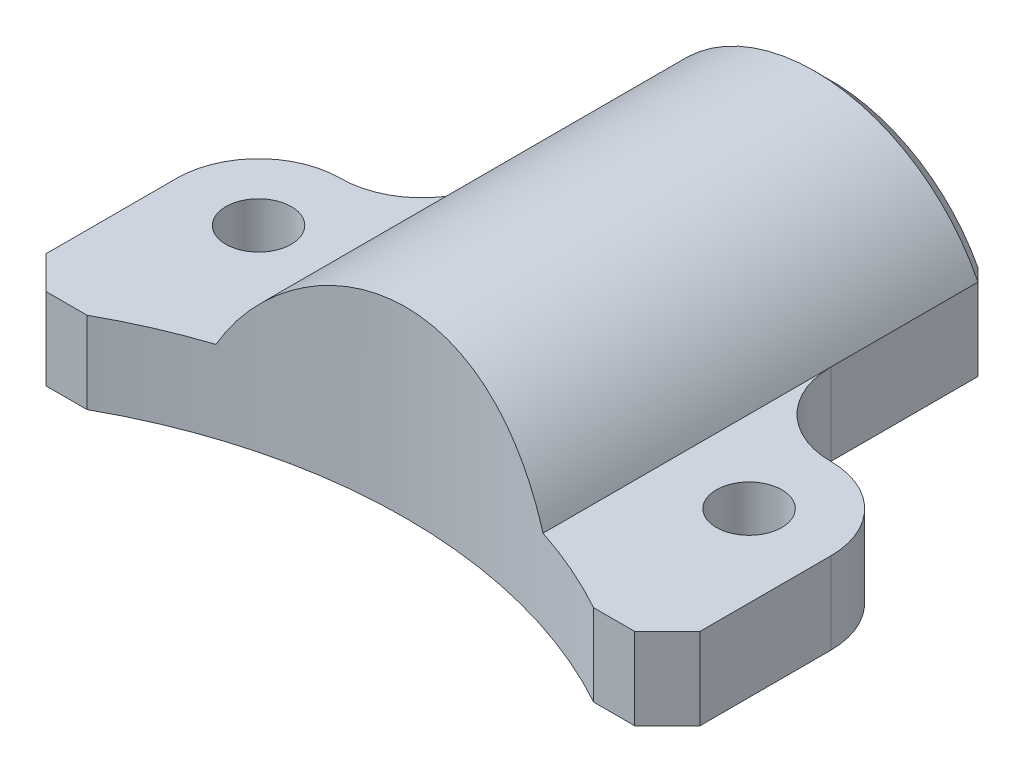
ISO-10303-21;
HEADER;
FILE_DESCRIPTION(('STEP AP214'),'2;1');
FILE_NAME('part.step','',(''),(''),'','','');
FILE_SCHEMA(('AUTOMOTIVE_DESIGN { 1 0 10303 214 1 1 1 1 }'));
ENDSEC;
DATA;
#1=APPLICATION_CONTEXT('core data for automotive mechanical design processes');
#2=APPLICATION_PROTOCOL_DEFINITION('international standard','automotive_design',2000,#1);
#3=PRODUCT_CONTEXT('',#1,'mechanical');
#4=PRODUCT('Part','Part','',(#3));
#5=PRODUCT_RELATED_PRODUCT_CATEGORY('part','',(#4));
#6=PRODUCT_DEFINITION_FORMATION('','',#4);
#7=PRODUCT_DEFINITION_CONTEXT('part definition',#1,'design');
#8=PRODUCT_DEFINITION('design','',#6,#7);
#9=PRODUCT_DEFINITION_SHAPE('','',#8);
#10=(LENGTH_UNIT() NAMED_UNIT(*) SI_UNIT(.MILLI.,.METRE.));
#11=(NAMED_UNIT(*) PLANE_ANGLE_UNIT() SI_UNIT($,.RADIAN.));
#12=(NAMED_UNIT(*) SI_UNIT($,.STERADIAN.) SOLID_ANGLE_UNIT());
#13=UNCERTAINTY_MEASURE_WITH_UNIT(LENGTH_MEASURE(1.E-05),#10,'distance_accuracy_value','');
#14=(GEOMETRIC_REPRESENTATION_CONTEXT(3) GLOBAL_UNCERTAINTY_ASSIGNED_CONTEXT((#13)) GLOBAL_UNIT_ASSIGNED_CONTEXT((#10,
#11,#12)) REPRESENTATION_CONTEXT('',''));
#15=CARTESIAN_POINT('',(0.,0.,0.));
#16=DIRECTION('',(0.,0.,1.));
#17=DIRECTION('',(1.,0.,0.));
#18=AXIS2_PLACEMENT_3D('',#15,#16,#17);
#19=CARTESIAN_POINT('',(-20.,5.,15.));
#20=DIRECTION('',(0.,0.,-1.));
#21=DIRECTION('',(-1.,0.,0.));
#22=AXIS2_PLACEMENT_3D('',#19,#20,#21);
#23=PLANE('',#22);
#24=DIRECTION('',(1.,0.,0.));
#25=VECTOR('',#24,1.);
#26=CARTESIAN_POINT('',(-20.,5.,15.));
#27=LINE('',#26,#25);
#28=CARTESIAN_POINT('',(15.4919333848297,5.,15.));
#29=VERTEX_POINT('',#28);
#30=CARTESIAN_POINT('',(18.,5.,15.));
#31=VERTEX_POINT('',#30);
#32=EDGE_CURVE('E186',#29,#31,#27,.T.);
#33=ORIENTED_EDGE('',*,*,#32,.F.);
#34=DIRECTION('',(0.,-1.,0.));
#35=VECTOR('',#34,1.);
#36=CARTESIAN_POINT('',(15.4919333848297,11.1803398874989,15.));
#37=LINE('',#36,#35);
#38=CARTESIAN_POINT('',(15.4919333848297,0.,15.));
#39=VERTEX_POINT('',#38);
#40=EDGE_CURVE('E173',#29,#39,#37,.T.);
#41=ORIENTED_EDGE('',*,*,#40,.T.);
#42=DIRECTION('',(1.,0.,0.));
#43=VECTOR('',#42,1.);
#44=CARTESIAN_POINT('',(-20.,0.,15.));
#45=LINE('',#44,#43);
#46=CARTESIAN_POINT('',(18.,0.,15.));
#47=VERTEX_POINT('',#46);
#48=EDGE_CURVE('E184',#39,#47,#45,.T.);
#49=ORIENTED_EDGE('',*,*,#48,.T.);
#50=DIRECTION('',(0.,1.,0.));
#51=VECTOR('',#50,1.);
#52=CARTESIAN_POINT('',(18.,5.,15.));
#53=LINE('',#52,#51);
#54=EDGE_CURVE('E450',#47,#31,#53,.T.);
#55=ORIENTED_EDGE('',*,*,#54,.T.);
#56=EDGE_LOOP('',(#33,#41,#49,#55));
#57=FACE_BOUND('',#56,.T.);
#58=ADVANCED_FACE('F32',(#57),#23,.F.);
#59=CARTESIAN_POINT('',(0.,5.,0.));
#60=DIRECTION('',(0.,-1.,0.));
#61=DIRECTION('',(0.,0.,-1.));
#62=AXIS2_PLACEMENT_3D('',#59,#60,#61);
#63=PLANE('',#62);
#64=CARTESIAN_POINT('',(-15.,5.,5.));
#65=DIRECTION('',(0.,-1.,0.));
#66=DIRECTION('',(0.,0.,-1.));
#67=AXIS2_PLACEMENT_3D('',#64,#65,#66);
#68=CIRCLE('',#67,2.);
#69=CARTESIAN_POINT('',(-15.,5.,3.));
#70=VERTEX_POINT('',#69);
#71=EDGE_CURVE('E377',#70,#70,#68,.T.);
#72=ORIENTED_EDGE('',*,*,#71,.T.);
#73=EDGE_LOOP('',(#72));
#74=FACE_BOUND('',#73,.T.);
#75=CARTESIAN_POINT('',(-18.,5.,15.));
#76=VERTEX_POINT('',#75);
#77=CARTESIAN_POINT('',(-15.4919333848297,5.,15.));
#78=VERTEX_POINT('',#77);
#79=EDGE_CURVE('E207',#76,#78,#27,.T.);
#80=ORIENTED_EDGE('',*,*,#79,.T.);
#81=CARTESIAN_POINT('',(0.,5.,43.));
#82=DIRECTION('',(0.,-1.,0.));
#83=DIRECTION('',(0.,0.,-1.));
#84=AXIS2_PLACEMENT_3D('',#81,#82,#83);
#85=CIRCLE('',#84,32.);
#86=CARTESIAN_POINT('',(-10.,5.,12.6026316928587));
#87=VERTEX_POINT('',#86);
#88=EDGE_CURVE('E390',#78,#87,#85,.T.);
#89=ORIENTED_EDGE('',*,*,#88,.T.);
#90=DIRECTION('',(0.,0.,1.));
#91=VECTOR('',#90,1.);
#92=CARTESIAN_POINT('',(-10.,5.,-15.));
#93=LINE('',#92,#91);
#94=CARTESIAN_POINT('',(-10.,5.,-5.));
#95=VERTEX_POINT('',#94);
#96=EDGE_CURVE('E365',#95,#87,#93,.T.);
#97=ORIENTED_EDGE('',*,*,#96,.F.);
#98=CARTESIAN_POINT('',(-15.,5.,-5.));
#99=DIRECTION('',(0.,-1.,0.));
#100=DIRECTION('',(0.,0.,-1.));
#101=AXIS2_PLACEMENT_3D('',#98,#99,#100);
#102=CIRCLE('',#101,5.);
#103=CARTESIAN_POINT('',(-15.,5.,0.));
#104=VERTEX_POINT('',#103);
#105=EDGE_CURVE('E442',#95,#104,#102,.T.);
#106=ORIENTED_EDGE('',*,*,#105,.T.);
#107=CARTESIAN_POINT('',(-15.,5.,5.));
#108=DIRECTION('',(0.,-1.,0.));
#109=DIRECTION('',(0.,0.,-1.));
#110=AXIS2_PLACEMENT_3D('',#107,#108,#109);
#111=CIRCLE('',#110,5.);
#112=CARTESIAN_POINT('',(-20.,5.,5.));
#113=VERTEX_POINT('',#112);
#114=EDGE_CURVE('E458',#104,#113,#111,.F.);
#115=ORIENTED_EDGE('',*,*,#114,.T.);
#116=DIRECTION('',(0.,0.,1.));
#117=VECTOR('',#116,1.);
#118=CARTESIAN_POINT('',(-20.,5.,15.));
#119=LINE('',#118,#117);
#120=CARTESIAN_POINT('',(-20.,5.,13.));
#121=VERTEX_POINT('',#120);
#122=EDGE_CURVE('E360',#113,#121,#119,.T.);
#123=ORIENTED_EDGE('',*,*,#122,.T.);
#124=DIRECTION('',(-0.707106781186546,0.,-0.707106781186549));
#125=VECTOR('',#124,1.);
#126=CARTESIAN_POINT('',(-18.,5.,15.));
#127=LINE('',#126,#125);
#128=EDGE_CURVE('E336',#121,#76,#127,.F.);
#129=ORIENTED_EDGE('',*,*,#128,.T.);
#130=EDGE_LOOP('',(#80,#89,#97,#106,#115,#123,#129));
#131=FACE_BOUND('',#130,.T.);
#132=ADVANCED_FACE('F300',(#74,#131),#63,.F.);
#133=CARTESIAN_POINT('',(15.,5.,5.));
#134=DIRECTION('',(0.,-1.,0.));
#135=DIRECTION('',(0.,0.,-1.));
#136=AXIS2_PLACEMENT_3D('',#133,#134,#135);
#137=CIRCLE('',#136,2.);
#138=CARTESIAN_POINT('',(15.,5.,3.));
#139=VERTEX_POINT('',#138);
#140=EDGE_CURVE('E381',#139,#139,#137,.T.);
#141=ORIENTED_EDGE('',*,*,#140,.T.);
#142=EDGE_LOOP('',(#141));
#143=FACE_BOUND('',#142,.T.);
#144=DIRECTION('',(0.,0.,-1.));
#145=VECTOR('',#144,1.);
#146=CARTESIAN_POINT('',(10.,5.,-15.));
#147=LINE('',#146,#145);
#148=CARTESIAN_POINT('',(10.,5.,12.6026316928587));
#149=VERTEX_POINT('',#148);
#150=CARTESIAN_POINT('',(10.,5.,-5.));
#151=VERTEX_POINT('',#150);
#152=EDGE_CURVE('E353',#149,#151,#147,.T.);
#153=ORIENTED_EDGE('',*,*,#152,.F.);
#154=CARTESIAN_POINT('',(0.,5.,43.));
#155=DIRECTION('',(0.,-1.,0.));
#156=DIRECTION('',(0.,0.,-1.));
#157=AXIS2_PLACEMENT_3D('',#154,#155,#156);
#158=CIRCLE('',#157,32.);
#159=EDGE_CURVE('E52',#149,#29,#158,.T.);
#160=ORIENTED_EDGE('',*,*,#159,.T.);
#161=ORIENTED_EDGE('',*,*,#32,.T.);
#162=DIRECTION('',(-0.707106781186549,0.,0.707106781186546));
#163=VECTOR('',#162,1.);
#164=CARTESIAN_POINT('',(20.,5.,13.));
#165=LINE('',#164,#163);
#166=CARTESIAN_POINT('',(20.,5.,13.));
#167=VERTEX_POINT('',#166);
#168=EDGE_CURVE('E45',#31,#167,#165,.F.);
#169=ORIENTED_EDGE('',*,*,#168,.T.);
#170=DIRECTION('',(0.,0.,-1.));
#171=VECTOR('',#170,1.);
#172=CARTESIAN_POINT('',(20.,5.,15.));
#173=LINE('',#172,#171);
#174=CARTESIAN_POINT('',(20.,5.,5.));
#175=VERTEX_POINT('',#174);
#176=EDGE_CURVE('E197',#167,#175,#173,.T.);
#177=ORIENTED_EDGE('',*,*,#176,.T.);
#178=CARTESIAN_POINT('',(15.,5.,5.));
#179=DIRECTION('',(0.,-1.,0.));
#180=DIRECTION('',(0.,0.,-1.));
#181=AXIS2_PLACEMENT_3D('',#178,#179,#180);
#182=CIRCLE('',#181,5.);
#183=CARTESIAN_POINT('',(15.,5.,0.));
#184=VERTEX_POINT('',#183);
#185=EDGE_CURVE('E460',#175,#184,#182,.F.);
#186=ORIENTED_EDGE('',*,*,#185,.T.);
#187=CARTESIAN_POINT('',(15.,5.,-5.));
#188=DIRECTION('',(0.,-1.,0.));
#189=DIRECTION('',(0.,0.,-1.));
#190=AXIS2_PLACEMENT_3D('',#187,#188,#189);
#191=CIRCLE('',#190,5.);
#192=EDGE_CURVE('E396',#184,#151,#191,.T.);
#193=ORIENTED_EDGE('',*,*,#192,.T.);
#194=EDGE_LOOP('',(#153,#160,#161,#169,#177,#186,#193));
#195=FACE_BOUND('',#194,.T.);
#196=ADVANCED_FACE('F306',(#143,#195),#63,.F.);
#197=CARTESIAN_POINT('',(20.,5.,15.));
#198=DIRECTION('',(-1.,0.,0.));
#199=DIRECTION('',(0.,0.,1.));
#200=AXIS2_PLACEMENT_3D('',#197,#198,#199);
#201=PLANE('',#200);
#202=ORIENTED_EDGE('',*,*,#176,.F.);
#203=DIRECTION('',(0.,-1.,0.));
#204=VECTOR('',#203,1.);
#205=CARTESIAN_POINT('',(20.,5.,13.));
#206=LINE('',#205,#204);
#207=CARTESIAN_POINT('',(20.,0.,13.));
#208=VERTEX_POINT('',#207);
#209=EDGE_CURVE('E338',#167,#208,#206,.T.);
#210=ORIENTED_EDGE('',*,*,#209,.T.);
#211=DIRECTION('',(0.,0.,-1.));
#212=VECTOR('',#211,1.);
#213=CARTESIAN_POINT('',(20.,0.,15.));
#214=LINE('',#213,#212);
#215=CARTESIAN_POINT('',(20.,0.,5.));
#216=VERTEX_POINT('',#215);
#217=EDGE_CURVE('E347',#208,#216,#214,.T.);
#218=ORIENTED_EDGE('',*,*,#217,.T.);
#219=DIRECTION('',(0.,1.,0.));
#220=VECTOR('',#219,1.);
#221=CARTESIAN_POINT('',(20.,5.,5.));
#222=LINE('',#221,#220);
#223=EDGE_CURVE('E239',#216,#175,#222,.T.);
#224=ORIENTED_EDGE('',*,*,#223,.T.);
#225=EDGE_LOOP('',(#202,#210,#218,#224));
#226=FACE_BOUND('',#225,.T.);
#227=ADVANCED_FACE('F345',(#226),#201,.F.);
#228=CARTESIAN_POINT('',(-20.,5.,-15.));
#229=DIRECTION('',(0.,0.,1.));
#230=DIRECTION('',(1.,0.,0.));
#231=AXIS2_PLACEMENT_3D('',#228,#229,#230);
#232=PLANE('',#231);
#233=CARTESIAN_POINT('',(0.,0.,-15.));
#234=DIRECTION('',(0.,0.,1.));
#235=DIRECTION('',(1.,0.,0.));
#236=AXIS2_PLACEMENT_3D('',#233,#234,#235);
#237=CIRCLE('',#236,10.1803398874989);
#238=CARTESIAN_POINT('',(-8.99999999999972,4.7580794681265,-15.));
#239=VERTEX_POINT('',#238);
#240=CARTESIAN_POINT('',(8.99999999999972,4.7580794681265,-15.));
#241=VERTEX_POINT('',#240);
#242=EDGE_CURVE('E217',#239,#241,#237,.F.);
#243=ORIENTED_EDGE('',*,*,#242,.T.);
#244=DIRECTION('',(0.,-1.,0.));
#245=VECTOR('',#244,1.);
#246=CARTESIAN_POINT('',(8.99999999999999,5.,-15.));
#247=LINE('',#246,#245);
#248=CARTESIAN_POINT('',(8.99999999999999,0.,-15.));
#249=VERTEX_POINT('',#248);
#250=EDGE_CURVE('E221',#241,#249,#247,.T.);
#251=ORIENTED_EDGE('',*,*,#250,.T.);
#252=DIRECTION('',(-1.,0.,0.));
#253=VECTOR('',#252,1.);
#254=CARTESIAN_POINT('',(-20.,0.,-15.));
#255=LINE('',#254,#253);
#256=CARTESIAN_POINT('',(5.,0.,-15.));
#257=VERTEX_POINT('',#256);
#258=EDGE_CURVE('E199',#249,#257,#255,.T.);
#259=ORIENTED_EDGE('',*,*,#258,.T.);
#260=CARTESIAN_POINT('',(0.,0.,-15.));
#261=DIRECTION('',(0.,0.,1.));
#262=DIRECTION('',(1.,0.,0.));
#263=AXIS2_PLACEMENT_3D('',#260,#261,#262);
#264=CIRCLE('',#263,5.);
#265=CARTESIAN_POINT('',(-5.,0.,-15.));
#266=VERTEX_POINT('',#265);
#267=EDGE_CURVE('E215',#257,#266,#264,.T.);
#268=ORIENTED_EDGE('',*,*,#267,.T.);
#269=CARTESIAN_POINT('',(-8.99999999999999,0.,-15.));
#270=VERTEX_POINT('',#269);
#271=EDGE_CURVE('E352',#266,#270,#255,.T.);
#272=ORIENTED_EDGE('',*,*,#271,.T.);
#273=DIRECTION('',(0.,1.,0.));
#274=VECTOR('',#273,1.);
#275=CARTESIAN_POINT('',(-8.99999999999999,5.,-15.));
#276=LINE('',#275,#274);
#277=EDGE_CURVE('E219',#270,#239,#276,.T.);
#278=ORIENTED_EDGE('',*,*,#277,.T.);
#279=EDGE_LOOP('',(#243,#251,#259,#268,#272,#278));
#280=FACE_BOUND('',#279,.T.);
#281=ADVANCED_FACE('F319',(#280),#232,.F.);
#282=CARTESIAN_POINT('',(-20.,5.,15.));
#283=DIRECTION('',(1.,0.,0.));
#284=DIRECTION('',(0.,0.,-1.));
#285=AXIS2_PLACEMENT_3D('',#282,#283,#284);
#286=PLANE('',#285);
#287=DIRECTION('',(0.,0.,1.));
#288=VECTOR('',#287,1.);
#289=CARTESIAN_POINT('',(-20.,0.,15.));
#290=LINE('',#289,#288);
#291=CARTESIAN_POINT('',(-20.,0.,5.));
#292=VERTEX_POINT('',#291);
#293=CARTESIAN_POINT('',(-20.,0.,13.));
#294=VERTEX_POINT('',#293);
#295=EDGE_CURVE('E195',#292,#294,#290,.T.);
#296=ORIENTED_EDGE('',*,*,#295,.T.);
#297=DIRECTION('',(0.,1.,0.));
#298=VECTOR('',#297,1.);
#299=CARTESIAN_POINT('',(-20.,5.,13.));
#300=LINE('',#299,#298);
#301=EDGE_CURVE('E329',#294,#121,#300,.T.);
#302=ORIENTED_EDGE('',*,*,#301,.T.);
#303=ORIENTED_EDGE('',*,*,#122,.F.);
#304=DIRECTION('',(0.,1.,0.));
#305=VECTOR('',#304,1.);
#306=CARTESIAN_POINT('',(-20.,5.,5.));
#307=LINE('',#306,#305);
#308=EDGE_CURVE('E335',#113,#292,#307,.F.);
#309=ORIENTED_EDGE('',*,*,#308,.T.);
#310=EDGE_LOOP('',(#296,#302,#303,#309));
#311=FACE_BOUND('',#310,.T.);
#312=ADVANCED_FACE('F312',(#311),#286,.F.);
#313=CARTESIAN_POINT('',(-18.,0.,15.));
#314=VERTEX_POINT('',#313);
#315=CARTESIAN_POINT('',(-15.4919333848297,0.,15.));
#316=VERTEX_POINT('',#315);
#317=EDGE_CURVE('E194',#314,#316,#45,.T.);
#318=ORIENTED_EDGE('',*,*,#317,.T.);
#319=DIRECTION('',(0.,-1.,0.));
#320=VECTOR('',#319,1.);
#321=CARTESIAN_POINT('',(-15.4919333848297,11.1803398874989,15.));
#322=LINE('',#321,#320);
#323=EDGE_CURVE('E175',#316,#78,#322,.F.);
#324=ORIENTED_EDGE('',*,*,#323,.T.);
#325=ORIENTED_EDGE('',*,*,#79,.F.);
#326=DIRECTION('',(0.,-1.,0.));
#327=VECTOR('',#326,1.);
#328=CARTESIAN_POINT('',(-18.,5.,15.));
#329=LINE('',#328,#327);
#330=EDGE_CURVE('E325',#76,#314,#329,.T.);
#331=ORIENTED_EDGE('',*,*,#330,.T.);
#332=EDGE_LOOP('',(#318,#324,#325,#331));
#333=FACE_BOUND('',#332,.T.);
#334=ADVANCED_FACE('F302',(#333),#23,.F.);
#335=CARTESIAN_POINT('',(0.,0.,0.));
#336=DIRECTION('',(0.,-1.,0.));
#337=DIRECTION('',(0.,0.,-1.));
#338=AXIS2_PLACEMENT_3D('',#335,#336,#337);
#339=PLANE('',#338);
#340=CARTESIAN_POINT('',(0.,0.,43.));
#341=DIRECTION('',(0.,-1.,0.));
#342=DIRECTION('',(0.,0.,-1.));
#343=AXIS2_PLACEMENT_3D('',#340,#341,#342);
#344=CIRCLE('',#343,32.);
#345=EDGE_CURVE('E170',#316,#39,#344,.T.);
#346=ORIENTED_EDGE('',*,*,#345,.F.);
#347=ORIENTED_EDGE('',*,*,#317,.F.);
#348=DIRECTION('',(0.707106781186546,0.,0.707106781186549));
#349=VECTOR('',#348,1.);
#350=CARTESIAN_POINT('',(-16.5,0.,16.5));
#351=LINE('',#350,#349);
#352=EDGE_CURVE('E327',#314,#294,#351,.F.);
#353=ORIENTED_EDGE('',*,*,#352,.T.);
#354=ORIENTED_EDGE('',*,*,#295,.F.);
#355=CARTESIAN_POINT('',(-15.,0.,5.));
#356=DIRECTION('',(0.,-1.,0.));
#357=DIRECTION('',(0.,0.,-1.));
#358=AXIS2_PLACEMENT_3D('',#355,#356,#357);
#359=CIRCLE('',#358,5.);
#360=CARTESIAN_POINT('',(-15.,0.,0.));
#361=VERTEX_POINT('',#360);
#362=EDGE_CURVE('E457',#292,#361,#359,.T.);
#363=ORIENTED_EDGE('',*,*,#362,.T.);
#364=CARTESIAN_POINT('',(-15.,0.,-5.));
#365=DIRECTION('',(0.,-1.,0.));
#366=DIRECTION('',(0.,0.,-1.));
#367=AXIS2_PLACEMENT_3D('',#364,#365,#366);
#368=CIRCLE('',#367,5.);
#369=CARTESIAN_POINT('',(-10.,0.,-5.));
#370=VERTEX_POINT('',#369);
#371=EDGE_CURVE('E444',#361,#370,#368,.F.);
#372=ORIENTED_EDGE('',*,*,#371,.T.);
#373=DIRECTION('',(0.,0.,-1.));
#374=VECTOR('',#373,1.);
#375=CARTESIAN_POINT('',(-10.,0.,-15.));
#376=LINE('',#375,#374);
#377=CARTESIAN_POINT('',(-10.,0.,-14.));
#378=VERTEX_POINT('',#377);
#379=EDGE_CURVE('E373',#370,#378,#376,.T.);
#380=ORIENTED_EDGE('',*,*,#379,.T.);
#381=DIRECTION('',(-0.707106781186549,0.,0.707106781186546));
#382=VECTOR('',#381,1.);
#383=CARTESIAN_POINT('',(-12.,0.,-12.));
#384=LINE('',#383,#382);
#385=EDGE_CURVE('E227',#378,#270,#384,.F.);
#386=ORIENTED_EDGE('',*,*,#385,.T.);
#387=ORIENTED_EDGE('',*,*,#271,.F.);
#388=DIRECTION('',(-0.707106781186547,0.,-0.707106781186548));
#389=VECTOR('',#388,1.);
#390=CARTESIAN_POINT('',(0.,0.,-10.));
#391=LINE('',#390,#389);
#392=CARTESIAN_POINT('',(-4.,0.,-14.));
#393=VERTEX_POINT('',#392);
#394=EDGE_CURVE('E223',#266,#393,#391,.F.);
#395=ORIENTED_EDGE('',*,*,#394,.T.);
#396=DIRECTION('',(0.,0.,-1.));
#397=VECTOR('',#396,1.);
#398=CARTESIAN_POINT('',(-4.,0.,5.));
#399=LINE('',#398,#397);
#400=CARTESIAN_POINT('',(-4.,0.,5.));
#401=VERTEX_POINT('',#400);
#402=EDGE_CURVE('E209',#401,#393,#399,.T.);
#403=ORIENTED_EDGE('',*,*,#402,.F.);
#404=DIRECTION('',(1.,0.,0.));
#405=VECTOR('',#404,1.);
#406=CARTESIAN_POINT('',(0.,0.,5.));
#407=LINE('',#406,#405);
#408=CARTESIAN_POINT('',(4.,0.,5.));
#409=VERTEX_POINT('',#408);
#410=EDGE_CURVE('E203',#401,#409,#407,.T.);
#411=ORIENTED_EDGE('',*,*,#410,.T.);
#412=DIRECTION('',(0.,0.,-1.));
#413=VECTOR('',#412,1.);
#414=CARTESIAN_POINT('',(4.,0.,5.));
#415=LINE('',#414,#413);
#416=CARTESIAN_POINT('',(4.,0.,-14.));
#417=VERTEX_POINT('',#416);
#418=EDGE_CURVE('E206',#417,#409,#415,.F.);
#419=ORIENTED_EDGE('',*,*,#418,.F.);
#420=DIRECTION('',(-0.707106781186547,0.,0.707106781186548));
#421=VECTOR('',#420,1.);
#422=CARTESIAN_POINT('',(0.,0.,-10.));
#423=LINE('',#422,#421);
#424=EDGE_CURVE('E225',#417,#257,#423,.F.);
#425=ORIENTED_EDGE('',*,*,#424,.T.);
#426=ORIENTED_EDGE('',*,*,#258,.F.);
#427=DIRECTION('',(-0.707106781186548,0.,-0.707106781186547));
#428=VECTOR('',#427,1.);
#429=CARTESIAN_POINT('',(12.,0.,-12.));
#430=LINE('',#429,#428);
#431=CARTESIAN_POINT('',(10.,0.,-14.));
#432=VERTEX_POINT('',#431);
#433=EDGE_CURVE('E229',#249,#432,#430,.F.);
#434=ORIENTED_EDGE('',*,*,#433,.T.);
#435=DIRECTION('',(0.,0.,1.));
#436=VECTOR('',#435,1.);
#437=CARTESIAN_POINT('',(10.,0.,-15.));
#438=LINE('',#437,#436);
#439=CARTESIAN_POINT('',(10.,0.,-5.));
#440=VERTEX_POINT('',#439);
#441=EDGE_CURVE('E369',#432,#440,#438,.T.);
#442=ORIENTED_EDGE('',*,*,#441,.T.);
#443=CARTESIAN_POINT('',(15.,0.,-5.));
#444=DIRECTION('',(0.,-1.,0.));
#445=DIRECTION('',(0.,0.,-1.));
#446=AXIS2_PLACEMENT_3D('',#443,#444,#445);
#447=CIRCLE('',#446,5.);
#448=CARTESIAN_POINT('',(15.,0.,0.));
#449=VERTEX_POINT('',#448);
#450=EDGE_CURVE('E439',#440,#449,#447,.F.);
#451=ORIENTED_EDGE('',*,*,#450,.T.);
#452=CARTESIAN_POINT('',(15.,0.,5.));
#453=DIRECTION('',(0.,-1.,0.));
#454=DIRECTION('',(0.,0.,-1.));
#455=AXIS2_PLACEMENT_3D('',#452,#453,#454);
#456=CIRCLE('',#455,5.);
#457=EDGE_CURVE('E350',#449,#216,#456,.T.);
#458=ORIENTED_EDGE('',*,*,#457,.T.);
#459=ORIENTED_EDGE('',*,*,#217,.F.);
#460=DIRECTION('',(0.707106781186549,0.,-0.707106781186546));
#461=VECTOR('',#460,1.);
#462=CARTESIAN_POINT('',(16.5,0.,16.5));
#463=LINE('',#462,#461);
#464=EDGE_CURVE('E192',#208,#47,#463,.F.);
#465=ORIENTED_EDGE('',*,*,#464,.T.);
#466=ORIENTED_EDGE('',*,*,#48,.F.);
#467=EDGE_LOOP('',(#346,#347,#353,#354,#363,#372,#380,#386,#387,#395,#403,#411,#419,#425,#426,
#434,#442,#451,#458,#459,#465,#466));
#468=FACE_BOUND('',#467,.T.);
#469=CARTESIAN_POINT('',(-15.,0.,5.));
#470=DIRECTION('',(0.,-1.,0.));
#471=DIRECTION('',(0.,0.,-1.));
#472=AXIS2_PLACEMENT_3D('',#469,#470,#471);
#473=CIRCLE('',#472,2.);
#474=CARTESIAN_POINT('',(-15.,0.,3.));
#475=VERTEX_POINT('',#474);
#476=EDGE_CURVE('E384',#475,#475,#473,.T.);
#477=ORIENTED_EDGE('',*,*,#476,.F.);
#478=EDGE_LOOP('',(#477));
#479=FACE_BOUND('',#478,.T.);
#480=CARTESIAN_POINT('',(15.,0.,5.));
#481=DIRECTION('',(0.,-1.,0.));
#482=DIRECTION('',(0.,0.,-1.));
#483=AXIS2_PLACEMENT_3D('',#480,#481,#482);
#484=CIRCLE('',#483,2.);
#485=CARTESIAN_POINT('',(15.,0.,3.));
#486=VERTEX_POINT('',#485);
#487=EDGE_CURVE('E187',#486,#486,#484,.T.);
#488=ORIENTED_EDGE('',*,*,#487,.F.);
#489=EDGE_LOOP('',(#488));
#490=FACE_BOUND('',#489,.T.);
#491=ADVANCED_FACE('F189',(#468,#479,#490),#339,.T.);
#492=CARTESIAN_POINT('',(0.,0.,15.));
#493=DIRECTION('',(0.,0.,-1.));
#494=DIRECTION('',(-1.,0.,0.));
#495=AXIS2_PLACEMENT_3D('',#492,#493,#494);
#496=CYLINDRICAL_SURFACE('',#495,11.1803398874989);
#497=ORIENTED_EDGE('',*,*,#96,.T.);
#498=CARTESIAN_POINT('',(-10.,5.,12.6026316928587));
#499=CARTESIAN_POINT('',(-9.85733095476085,5.28538677865506,12.5557051294286));
#500=CARTESIAN_POINT('',(-9.70261430657445,5.56423447440532,12.5059112731761));
#501=CARTESIAN_POINT('',(-9.37038664772705,6.10712511439352,12.4021855431533));
#502=CARTESIAN_POINT('',(-9.19287989703682,6.37117081223209,12.3482544434811));
#503=CARTESIAN_POINT('',(-8.81636919464195,6.88277000318012,12.2378469082265));
#504=CARTESIAN_POINT('',(-8.6173710245142,7.13032790297381,12.1813711595711));
#505=CARTESIAN_POINT('',(-8.19916362996784,7.60752004759262,12.0674817885665));
#506=CARTESIAN_POINT('',(-7.97995370630648,7.83715367180437,12.0100681338263));
#507=CARTESIAN_POINT('',(-7.5227434150498,8.27701344797925,11.8959194175693));
#508=CARTESIAN_POINT('',(-7.2847452032316,8.48724182052293,11.8391842790569));
#509=CARTESIAN_POINT('',(-6.7914092164251,8.88693087212629,11.7279567702344));
#510=CARTESIAN_POINT('',(-6.53607139998277,9.0763915015334,11.6734644052865));
#511=CARTESIAN_POINT('',(-6.00955310689551,9.43326289146722,11.5682110015923));
#512=CARTESIAN_POINT('',(-5.73836701231335,9.60066576362303,11.5174513005865));
#513=CARTESIAN_POINT('',(-5.18199138405205,9.91204221081976,11.4211042781385));
#514=CARTESIAN_POINT('',(-4.8968025416088,10.056016940864,11.3755167017451));
#515=CARTESIAN_POINT('',(-4.31612761757429,10.3185240787737,11.2910646217002));
#516=CARTESIAN_POINT('',(-4.02071555448648,10.4372073466712,11.252160538281));
#517=CARTESIAN_POINT('',(-3.42005640821682,10.649160586239,11.1818508152202));
#518=CARTESIAN_POINT('',(-3.11481011881315,10.7424326032824,11.1504445720963));
#519=CARTESIAN_POINT('',(-2.49746908438568,10.9024818713426,11.0961059322814));
#520=CARTESIAN_POINT('',(-2.18539166682113,10.9693194445242,11.0731542509922));
#521=CARTESIAN_POINT('',(-1.55628613474362,11.0760847779255,11.0363155637035));
#522=CARTESIAN_POINT('',(-1.23926128220349,11.1160295610101,11.0224228236613));
#523=CARTESIAN_POINT('',(-0.767930499199652,11.1549953680982,11.0088479229354));
#524=CARTESIAN_POINT('',(-0.614524479664455,11.1644963933619,11.0055325803915));
#525=CARTESIAN_POINT('',(-0.307418804548628,11.1771691797486,11.0011082283542));
#526=CARTESIAN_POINT('',(-0.153719149735247,11.1803409573869,10.9999992131036));
#527=CARTESIAN_POINT('',(0.303672537155638,11.1803377739328,11.0000015545157));
#528=CARTESIAN_POINT('',(0.60742115537703,11.1679532757158,11.0043342333471));
#529=CARTESIAN_POINT('',(1.21278780816226,11.1185188407492,11.0215550700917));
#530=CARTESIAN_POINT('',(1.51440455281978,11.0814550800344,11.0344480229877));
#531=CARTESIAN_POINT('',(2.11377452687934,10.9829125041821,11.0684760104094));
#532=CARTESIAN_POINT('',(2.41151888157711,10.921385288796,11.0896273824792));
#533=CARTESIAN_POINT('',(3.00041487580985,10.7744892731343,11.139603663327));
#534=CARTESIAN_POINT('',(3.29156615643876,10.6891191782847,11.1684289887664));
#535=CARTESIAN_POINT('',(3.86444281899532,10.4955813462217,11.2328954259216));
#536=CARTESIAN_POINT('',(4.14619331162709,10.387481115834,11.2685163268645));
#537=CARTESIAN_POINT('',(4.699363884488,10.1492206127983,11.345711469181));
#538=CARTESIAN_POINT('',(4.97078356402702,10.0190594855636,11.3872859411721));
#539=CARTESIAN_POINT('',(5.50157456279627,9.73770429971509,11.4753264390578));
#540=CARTESIAN_POINT('',(5.76094858352635,9.58651498780995,11.5217913604532));
#541=CARTESIAN_POINT('',(6.26632413499774,9.26407415355174,11.6184861538583));
#542=CARTESIAN_POINT('',(6.5123197510377,9.09281386153749,11.6687176681359));
#543=CARTESIAN_POINT('',(6.99775468778623,8.72509839121395,11.7734853672926));
#544=CARTESIAN_POINT('',(7.23666790817191,8.52797381670564,11.8281105233845));
#545=CARTESIAN_POINT('',(7.69707462792563,8.11484246779718,11.9385918469212));
#546=CARTESIAN_POINT('',(7.91857518093183,7.89884341485074,11.994447504045));
#547=CARTESIAN_POINT('',(8.34276354270982,7.4494093514828,12.1058847833519));
#548=CARTESIAN_POINT('',(8.54546759057209,7.21598971216807,12.1614666020485));
#549=CARTESIAN_POINT('',(8.93095719673351,6.73300941623882,12.2708911119078));
#550=CARTESIAN_POINT('',(9.11375148502788,6.48345591108794,12.3247345579628));
#551=CARTESIAN_POINT('',(9.41773848344294,6.03010370721677,12.4169136740298));
#552=CARTESIAN_POINT('',(9.54330464109003,5.82935804881139,12.4559169011249));
#553=CARTESIAN_POINT('',(9.78144329088214,5.42026938613853,12.5313457601429));
#554=CARTESIAN_POINT('',(9.89403580182705,5.21193875767883,12.5677753287702));
#555=CARTESIAN_POINT('',(10.,5.,12.6026316928587));
#556=B_SPLINE_CURVE_WITH_KNOTS('',3,(#498,#499,#500,#501,#502,#503,#504,#505,#506,#507,#508,
#509,#510,#511,#512,#513,#514,#515,#516,#517,#518,#519,#520,#521,#522,#523,#524,#525,#526,#527,
#528,#529,#530,#531,#532,#533,#534,#535,#536,#537,#538,#539,#540,#541,#542,#543,#544,#545,#546,
#547,#548,#549,#550,#551,#552,#553,#554,#555),.UNSPECIFIED.,.F.,.F.,(4,2,2,2,2,2,2,2,2,2,2,2,2,
2,2,2,2,2,2,2,2,2,2,2,2,2,2,2,4),(0.,0.967123401938696,1.93406628974629,2.90074969751456,
3.86746656107185,4.83407266384814,5.80068107758486,6.76763424031321,7.7345397179694,
8.6955054568024,9.65639382382028,10.615076659242,11.5731520861151,12.0342347137329,
12.4953161382156,13.4061835626659,14.3175616346304,15.2307518867935,16.1439917312147,
17.0545566907385,17.9651569314505,18.8755519542534,19.7863462516436,20.7288373720468,
21.6709447132165,22.6122303934728,23.5531016646828,24.2725551583247,24.9908832066602),.UNSPECIFIED.);
#557=EDGE_CURVE('E11',#87,#149,#556,.T.);
#558=ORIENTED_EDGE('',*,*,#557,.T.);
#559=ORIENTED_EDGE('',*,*,#152,.T.);
#560=DIRECTION('',(0.,0.,1.));
#561=VECTOR('',#560,1.);
#562=CARTESIAN_POINT('',(10.,5.,-15.));
#563=LINE('',#562,#561);
#564=CARTESIAN_POINT('',(10.,5.,-14.));
#565=VERTEX_POINT('',#564);
#566=EDGE_CURVE('E366',#565,#151,#563,.T.);
#567=ORIENTED_EDGE('',*,*,#566,.F.);
#568=CARTESIAN_POINT('',(0.,0.,-14.));
#569=DIRECTION('',(0.,0.,1.));
#570=DIRECTION('',(1.,0.,0.));
#571=AXIS2_PLACEMENT_3D('',#568,#569,#570);
#572=CIRCLE('',#571,11.1803398874989);
#573=CARTESIAN_POINT('',(-10.,5.,-14.));
#574=VERTEX_POINT('',#573);
#575=EDGE_CURVE('E234',#565,#574,#572,.T.);
#576=ORIENTED_EDGE('',*,*,#575,.T.);
#577=EDGE_CURVE('E356',#574,#95,#93,.T.);
#578=ORIENTED_EDGE('',*,*,#577,.T.);
#579=EDGE_LOOP('',(#497,#558,#559,#567,#576,#578));
#580=FACE_BOUND('',#579,.T.);
#581=ADVANCED_FACE('F318',(#580),#496,.T.);
#582=CARTESIAN_POINT('',(10.,0.,-15.));
#583=DIRECTION('',(-1.,0.,0.));
#584=DIRECTION('',(0.,0.,1.));
#585=AXIS2_PLACEMENT_3D('',#582,#583,#584);
#586=PLANE('',#585);
#587=ORIENTED_EDGE('',*,*,#566,.T.);
#588=DIRECTION('',(0.,1.,0.));
#589=VECTOR('',#588,1.);
#590=CARTESIAN_POINT('',(10.,0.,-5.));
#591=LINE('',#590,#589);
#592=EDGE_CURVE('E404',#151,#440,#591,.F.);
#593=ORIENTED_EDGE('',*,*,#592,.T.);
#594=ORIENTED_EDGE('',*,*,#441,.F.);
#595=DIRECTION('',(0.,1.,0.));
#596=VECTOR('',#595,1.);
#597=CARTESIAN_POINT('',(10.,0.,-14.));
#598=LINE('',#597,#596);
#599=EDGE_CURVE('E212',#432,#565,#598,.T.);
#600=ORIENTED_EDGE('',*,*,#599,.T.);
#601=EDGE_LOOP('',(#587,#593,#594,#600));
#602=FACE_BOUND('',#601,.T.);
#603=ADVANCED_FACE('F402',(#602),#586,.F.);
#604=CARTESIAN_POINT('',(-10.,0.,-15.));
#605=DIRECTION('',(1.,0.,0.));
#606=DIRECTION('',(0.,0.,-1.));
#607=AXIS2_PLACEMENT_3D('',#604,#605,#606);
#608=PLANE('',#607);
#609=ORIENTED_EDGE('',*,*,#379,.F.);
#610=DIRECTION('',(0.,1.,0.));
#611=VECTOR('',#610,1.);
#612=CARTESIAN_POINT('',(-10.,5.,-5.));
#613=LINE('',#612,#611);
#614=EDGE_CURVE('E423',#370,#95,#613,.T.);
#615=ORIENTED_EDGE('',*,*,#614,.T.);
#616=ORIENTED_EDGE('',*,*,#577,.F.);
#617=DIRECTION('',(0.,-1.,0.));
#618=VECTOR('',#617,1.);
#619=CARTESIAN_POINT('',(-10.,0.,-14.));
#620=LINE('',#619,#618);
#621=EDGE_CURVE('E231',#574,#378,#620,.T.);
#622=ORIENTED_EDGE('',*,*,#621,.T.);
#623=EDGE_LOOP('',(#609,#615,#616,#622));
#624=FACE_BOUND('',#623,.T.);
#625=ADVANCED_FACE('F420',(#624),#608,.F.);
#626=CARTESIAN_POINT('',(0.,0.,5.));
#627=DIRECTION('',(0.,0.,-1.));
#628=DIRECTION('',(-1.,0.,0.));
#629=AXIS2_PLACEMENT_3D('',#626,#627,#628);
#630=CYLINDRICAL_SURFACE('',#629,4.);
#631=ORIENTED_EDGE('',*,*,#402,.T.);
#632=CARTESIAN_POINT('',(0.,0.,-14.));
#633=DIRECTION('',(0.,0.,1.));
#634=DIRECTION('',(1.,0.,0.));
#635=AXIS2_PLACEMENT_3D('',#632,#633,#634);
#636=CIRCLE('',#635,4.);
#637=EDGE_CURVE('E236',#393,#417,#636,.F.);
#638=ORIENTED_EDGE('',*,*,#637,.T.);
#639=ORIENTED_EDGE('',*,*,#418,.T.);
#640=CARTESIAN_POINT('',(0.,0.,5.));
#641=DIRECTION('',(0.,0.,-1.));
#642=DIRECTION('',(-1.,0.,0.));
#643=AXIS2_PLACEMENT_3D('',#640,#641,#642);
#644=CIRCLE('',#643,4.);
#645=EDGE_CURVE('E370',#401,#409,#644,.T.);
#646=ORIENTED_EDGE('',*,*,#645,.F.);
#647=EDGE_LOOP('',(#631,#638,#639,#646));
#648=FACE_BOUND('',#647,.T.);
#649=ADVANCED_FACE('F435',(#648),#630,.F.);
#650=CARTESIAN_POINT('',(0.,0.,5.));
#651=DIRECTION('',(0.,0.,-1.));
#652=DIRECTION('',(-1.,0.,0.));
#653=AXIS2_PLACEMENT_3D('',#650,#651,#652);
#654=PLANE('',#653);
#655=ORIENTED_EDGE('',*,*,#645,.T.);
#656=ORIENTED_EDGE('',*,*,#410,.F.);
#657=EDGE_LOOP('',(#655,#656));
#658=FACE_BOUND('',#657,.T.);
#659=ADVANCED_FACE('F266',(#658),#654,.T.);
#660=CARTESIAN_POINT('',(-8.99999999999999,5.,-15.));
#661=DIRECTION('',(0.707106781186546,0.,0.707106781186549));
#662=DIRECTION('',(0.,1.,0.));
#663=AXIS2_PLACEMENT_3D('',#660,#661,#662);
#664=PLANE('',#663);
#665=ORIENTED_EDGE('',*,*,#385,.F.);
#666=ORIENTED_EDGE('',*,*,#621,.F.);
#667=CARTESIAN_POINT('',(-8.99999999999999,4.75807946812664,-15.));
#668=CARTESIAN_POINT('',(-9.1665492415589,4.79937061278084,-14.8334507584411));
#669=CARTESIAN_POINT('',(-9.33315721224131,4.84017623334003,-14.6668427877587));
#670=CARTESIAN_POINT('',(-9.66649054562129,4.92081641024555,-14.3335094543787));
#671=CARTESIAN_POINT('',(-9.83321590827218,4.96065096697776,-14.1667840917278));
#672=CARTESIAN_POINT('',(-9.9999999999999,5.00000000000086,-14.0000000000001));
#673=B_SPLINE_CURVE_WITH_KNOTS('',3,(#667,#668,#669,#670,#671,#672),.UNSPECIFIED.,.F.,.F.,(4,2,
4),(0.,0.717379797688359,1.43475931029638),.UNSPECIFIED.);
#674=EDGE_CURVE('E247',#239,#574,#673,.T.);
#675=ORIENTED_EDGE('',*,*,#674,.F.);
#676=ORIENTED_EDGE('',*,*,#277,.F.);
#677=EDGE_LOOP('',(#665,#666,#675,#676));
#678=FACE_BOUND('',#677,.T.);
#679=ADVANCED_FACE('F262',(#678),#664,.F.);
#680=CARTESIAN_POINT('',(0.,0.,-14.));
#681=DIRECTION('',(0.,0.,1.));
#682=DIRECTION('',(1.,0.,0.));
#683=AXIS2_PLACEMENT_3D('',#680,#681,#682);
#684=CONICAL_SURFACE('',#683,11.1803398874989,0.785398163397451);
#685=ORIENTED_EDGE('',*,*,#674,.T.);
#686=ORIENTED_EDGE('',*,*,#575,.F.);
#687=CARTESIAN_POINT('',(10.,5.,-14.));
#688=CARTESIAN_POINT('',(9.83321590827223,4.96065096697731,-14.1667840917278));
#689=CARTESIAN_POINT('',(9.66649054562131,4.92081641024538,-14.3335094543787));
#690=CARTESIAN_POINT('',(9.33315721224129,4.84017623334019,-14.6668427877587));
#691=CARTESIAN_POINT('',(9.16654924155887,4.79937061278105,-14.8334507584411));
#692=CARTESIAN_POINT('',(8.99999999999998,4.75807946812677,-15.));
#693=B_SPLINE_CURVE_WITH_KNOTS('',3,(#687,#688,#689,#690,#691,#692),.UNSPECIFIED.,.F.,.F.,(4,2,
4),(0.,0.71737951260803,1.43475931029639),.UNSPECIFIED.);
#694=EDGE_CURVE('E240',#241,#565,#693,.F.);
#695=ORIENTED_EDGE('',*,*,#694,.F.);
#696=ORIENTED_EDGE('',*,*,#242,.F.);
#697=EDGE_LOOP('',(#685,#686,#695,#696));
#698=FACE_BOUND('',#697,.T.);
#699=ADVANCED_FACE('F254',(#698),#684,.T.);
#700=CARTESIAN_POINT('',(10.,0.,-14.));
#701=DIRECTION('',(-0.707106781186547,0.,0.707106781186548));
#702=DIRECTION('',(0.,1.,0.));
#703=AXIS2_PLACEMENT_3D('',#700,#701,#702);
#704=PLANE('',#703);
#705=ORIENTED_EDGE('',*,*,#433,.F.);
#706=ORIENTED_EDGE('',*,*,#250,.F.);
#707=ORIENTED_EDGE('',*,*,#694,.T.);
#708=ORIENTED_EDGE('',*,*,#599,.F.);
#709=EDGE_LOOP('',(#705,#706,#707,#708));
#710=FACE_BOUND('',#709,.T.);
#711=ADVANCED_FACE('F257',(#710),#704,.F.);
#712=CARTESIAN_POINT('',(0.,0.,-14.));
#713=DIRECTION('',(0.,0.,-1.));
#714=DIRECTION('',(-1.,0.,0.));
#715=AXIS2_PLACEMENT_3D('',#712,#713,#714);
#716=CONICAL_SURFACE('',#715,4.,0.785398163397448);
#717=ORIENTED_EDGE('',*,*,#394,.F.);
#718=ORIENTED_EDGE('',*,*,#267,.F.);
#719=ORIENTED_EDGE('',*,*,#424,.F.);
#720=ORIENTED_EDGE('',*,*,#637,.F.);
#721=EDGE_LOOP('',(#717,#718,#719,#720));
#722=FACE_BOUND('',#721,.T.);
#723=ADVANCED_FACE('F260',(#722),#716,.F.);
#724=CARTESIAN_POINT('',(15.,0.,-5.));
#725=DIRECTION('',(0.,-1.,0.));
#726=DIRECTION('',(0.,0.,-1.));
#727=AXIS2_PLACEMENT_3D('',#724,#725,#726);
#728=CYLINDRICAL_SURFACE('',#727,5.);
#729=DIRECTION('',(0.,1.,0.));
#730=VECTOR('',#729,1.);
#731=CARTESIAN_POINT('',(15.,5.,0.));
#732=LINE('',#731,#730);
#733=EDGE_CURVE('E248',#449,#184,#732,.T.);
#734=ORIENTED_EDGE('',*,*,#733,.F.);
#735=ORIENTED_EDGE('',*,*,#450,.F.);
#736=ORIENTED_EDGE('',*,*,#592,.F.);
#737=ORIENTED_EDGE('',*,*,#192,.F.);
#738=EDGE_LOOP('',(#734,#735,#736,#737));
#739=FACE_BOUND('',#738,.T.);
#740=ADVANCED_FACE('F270',(#739),#728,.F.);
#741=CARTESIAN_POINT('',(15.,5.,5.));
#742=DIRECTION('',(0.,1.,0.));
#743=DIRECTION('',(0.,0.,1.));
#744=AXIS2_PLACEMENT_3D('',#741,#742,#743);
#745=CYLINDRICAL_SURFACE('',#744,5.);
#746=ORIENTED_EDGE('',*,*,#457,.F.);
#747=ORIENTED_EDGE('',*,*,#733,.T.);
#748=ORIENTED_EDGE('',*,*,#185,.F.);
#749=ORIENTED_EDGE('',*,*,#223,.F.);
#750=EDGE_LOOP('',(#746,#747,#748,#749));
#751=FACE_BOUND('',#750,.T.);
#752=ADVANCED_FACE('F272',(#751),#745,.T.);
#753=CARTESIAN_POINT('',(-15.,0.,-5.));
#754=DIRECTION('',(0.,-1.,0.));
#755=DIRECTION('',(0.,0.,-1.));
#756=AXIS2_PLACEMENT_3D('',#753,#754,#755);
#757=CYLINDRICAL_SURFACE('',#756,5.);
#758=ORIENTED_EDGE('',*,*,#614,.F.);
#759=ORIENTED_EDGE('',*,*,#371,.F.);
#760=DIRECTION('',(0.,1.,0.));
#761=VECTOR('',#760,1.);
#762=CARTESIAN_POINT('',(-15.,0.,0.));
#763=LINE('',#762,#761);
#764=EDGE_CURVE('E380',#104,#361,#763,.F.);
#765=ORIENTED_EDGE('',*,*,#764,.F.);
#766=ORIENTED_EDGE('',*,*,#105,.F.);
#767=EDGE_LOOP('',(#758,#759,#765,#766));
#768=FACE_BOUND('',#767,.T.);
#769=ADVANCED_FACE('F275',(#768),#757,.F.);
#770=CARTESIAN_POINT('',(-15.,0.,5.));
#771=DIRECTION('',(0.,1.,0.));
#772=DIRECTION('',(0.,0.,1.));
#773=AXIS2_PLACEMENT_3D('',#770,#771,#772);
#774=CYLINDRICAL_SURFACE('',#773,5.);
#775=ORIENTED_EDGE('',*,*,#362,.F.);
#776=ORIENTED_EDGE('',*,*,#308,.F.);
#777=ORIENTED_EDGE('',*,*,#114,.F.);
#778=ORIENTED_EDGE('',*,*,#764,.T.);
#779=EDGE_LOOP('',(#775,#776,#777,#778));
#780=FACE_BOUND('',#779,.T.);
#781=ADVANCED_FACE('F280',(#780),#774,.T.);
#782=CARTESIAN_POINT('',(15.,11.1803398874989,5.));
#783=DIRECTION('',(0.,-1.,0.));
#784=DIRECTION('',(0.,0.,-1.));
#785=AXIS2_PLACEMENT_3D('',#782,#783,#784);
#786=CYLINDRICAL_SURFACE('',#785,2.);
#787=ORIENTED_EDGE('',*,*,#487,.T.);
#788=EDGE_LOOP('',(#787));
#789=FACE_BOUND('',#788,.T.);
#790=ORIENTED_EDGE('',*,*,#140,.F.);
#791=EDGE_LOOP('',(#790));
#792=FACE_BOUND('',#791,.T.);
#793=ADVANCED_FACE('F283',(#789,#792),#786,.F.);
#794=CARTESIAN_POINT('',(-15.,11.1803398874989,5.));
#795=DIRECTION('',(0.,-1.,0.));
#796=DIRECTION('',(0.,0.,-1.));
#797=AXIS2_PLACEMENT_3D('',#794,#795,#796);
#798=CYLINDRICAL_SURFACE('',#797,2.);
#799=ORIENTED_EDGE('',*,*,#476,.T.);
#800=EDGE_LOOP('',(#799));
#801=FACE_BOUND('',#800,.T.);
#802=ORIENTED_EDGE('',*,*,#71,.F.);
#803=EDGE_LOOP('',(#802));
#804=FACE_BOUND('',#803,.T.);
#805=ADVANCED_FACE('F289',(#801,#804),#798,.F.);
#806=CARTESIAN_POINT('',(-18.,5.,15.));
#807=DIRECTION('',(0.707106781186549,0.,-0.707106781186546));
#808=DIRECTION('',(0.,-1.,0.));
#809=AXIS2_PLACEMENT_3D('',#806,#807,#808);
#810=PLANE('',#809);
#811=ORIENTED_EDGE('',*,*,#128,.F.);
#812=ORIENTED_EDGE('',*,*,#301,.F.);
#813=ORIENTED_EDGE('',*,*,#352,.F.);
#814=ORIENTED_EDGE('',*,*,#330,.F.);
#815=EDGE_LOOP('',(#811,#812,#813,#814));
#816=FACE_BOUND('',#815,.T.);
#817=ADVANCED_FACE('F287',(#816),#810,.F.);
#818=CARTESIAN_POINT('',(20.,5.,13.));
#819=DIRECTION('',(-0.707106781186546,0.,-0.707106781186549));
#820=DIRECTION('',(0.,-1.,0.));
#821=AXIS2_PLACEMENT_3D('',#818,#819,#820);
#822=PLANE('',#821);
#823=ORIENTED_EDGE('',*,*,#168,.F.);
#824=ORIENTED_EDGE('',*,*,#54,.F.);
#825=ORIENTED_EDGE('',*,*,#464,.F.);
#826=ORIENTED_EDGE('',*,*,#209,.F.);
#827=EDGE_LOOP('',(#823,#824,#825,#826));
#828=FACE_BOUND('',#827,.T.);
#829=ADVANCED_FACE('F34',(#828),#822,.F.);
#830=CARTESIAN_POINT('',(0.,11.1803398874989,43.));
#831=DIRECTION('',(0.,-1.,0.));
#832=DIRECTION('',(0.,0.,-1.));
#833=AXIS2_PLACEMENT_3D('',#830,#831,#832);
#834=CYLINDRICAL_SURFACE('',#833,32.);
#835=ORIENTED_EDGE('',*,*,#159,.F.);
#836=ORIENTED_EDGE('',*,*,#557,.F.);
#837=ORIENTED_EDGE('',*,*,#88,.F.);
#838=ORIENTED_EDGE('',*,*,#323,.F.);
#839=ORIENTED_EDGE('',*,*,#345,.T.);
#840=ORIENTED_EDGE('',*,*,#40,.F.);
#841=EDGE_LOOP('',(#835,#836,#837,#838,#839,#840));
#842=FACE_BOUND('',#841,.T.);
#843=ADVANCED_FACE('F172',(#842),#834,.F.);
#844=CLOSED_SHELL('',(#58,#132,#196,#227,#281,#312,#334,#491,#581,#603,#625,#649,#659,#679,#699,
#711,#723,#740,#752,#769,#781,#793,#805,#817,#829,#843));
#845=MANIFOLD_SOLID_BREP('B2',#844);
#846=ADVANCED_BREP_SHAPE_REPRESENTATION('',(#18,#845),#14);
#847=SHAPE_DEFINITION_REPRESENTATION(#9,#846);
ENDSEC;
END-ISO-10303-21;
